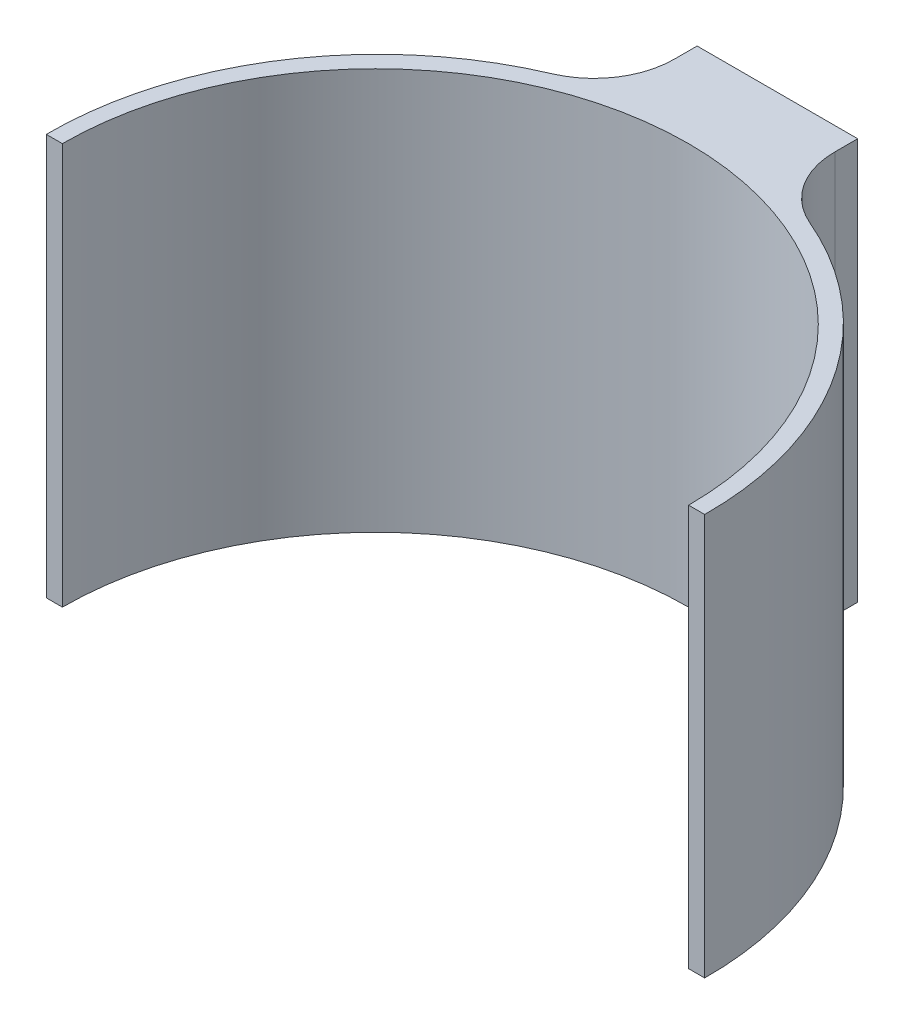
ISO-10303-21;
HEADER;
FILE_DESCRIPTION(('STEP AP214'),'2;1');
FILE_NAME('part.step','',(''),(''),'','','');
FILE_SCHEMA(('AUTOMOTIVE_DESIGN { 1 0 10303 214 1 1 1 1 }'));
ENDSEC;
DATA;
#1=APPLICATION_CONTEXT('core data for automotive mechanical design processes');
#2=APPLICATION_PROTOCOL_DEFINITION('international standard','automotive_design',2000,#1);
#3=PRODUCT_CONTEXT('',#1,'mechanical');
#4=PRODUCT('Part','Part','',(#3));
#5=PRODUCT_RELATED_PRODUCT_CATEGORY('part','',(#4));
#6=PRODUCT_DEFINITION_FORMATION('','',#4);
#7=PRODUCT_DEFINITION_CONTEXT('part definition',#1,'design');
#8=PRODUCT_DEFINITION('design','',#6,#7);
#9=PRODUCT_DEFINITION_SHAPE('','',#8);
#10=(LENGTH_UNIT() NAMED_UNIT(*) SI_UNIT(.MILLI.,.METRE.));
#11=(NAMED_UNIT(*) PLANE_ANGLE_UNIT() SI_UNIT($,.RADIAN.));
#12=(NAMED_UNIT(*) SI_UNIT($,.STERADIAN.) SOLID_ANGLE_UNIT());
#13=UNCERTAINTY_MEASURE_WITH_UNIT(LENGTH_MEASURE(1.E-05),#10,'distance_accuracy_value','');
#14=(GEOMETRIC_REPRESENTATION_CONTEXT(3) GLOBAL_UNCERTAINTY_ASSIGNED_CONTEXT((#13)) GLOBAL_UNIT_ASSIGNED_CONTEXT((#10,
#11,#12)) REPRESENTATION_CONTEXT('',''));
#15=CARTESIAN_POINT('',(0.,0.,0.));
#16=DIRECTION('',(0.,0.,1.));
#17=DIRECTION('',(1.,0.,0.));
#18=AXIS2_PLACEMENT_3D('',#15,#16,#17);
#19=CARTESIAN_POINT('',(39.,50.,0.));
#20=DIRECTION('',(0.,-1.,0.));
#21=DIRECTION('',(0.,0.,-1.));
#22=AXIS2_PLACEMENT_3D('',#19,#20,#21);
#23=CYLINDRICAL_SURFACE('',#22,39.);
#24=CARTESIAN_POINT('',(39.,0.,0.));
#25=DIRECTION('',(0.,-1.,0.));
#26=DIRECTION('',(0.,0.,-1.));
#27=AXIS2_PLACEMENT_3D('',#24,#25,#26);
#28=CIRCLE('',#27,39.);
#29=CARTESIAN_POINT('',(0.,0.,0.));
#30=VERTEX_POINT('',#29);
#31=CARTESIAN_POINT('',(78.,0.,0.));
#32=VERTEX_POINT('',#31);
#33=EDGE_CURVE('E136',#30,#32,#28,.T.);
#34=ORIENTED_EDGE('',*,*,#33,.T.);
#35=DIRECTION('',(0.,-1.,0.));
#36=VECTOR('',#35,1.);
#37=CARTESIAN_POINT('',(78.,50.,0.));
#38=LINE('',#37,#36);
#39=CARTESIAN_POINT('',(78.,50.,0.));
#40=VERTEX_POINT('',#39);
#41=EDGE_CURVE('E116',#40,#32,#38,.T.);
#42=ORIENTED_EDGE('',*,*,#41,.F.);
#43=CARTESIAN_POINT('',(39.,50.,0.));
#44=DIRECTION('',(0.,-1.,0.));
#45=DIRECTION('',(0.,0.,-1.));
#46=AXIS2_PLACEMENT_3D('',#43,#44,#45);
#47=CIRCLE('',#46,39.);
#48=CARTESIAN_POINT('',(0.,50.,0.));
#49=VERTEX_POINT('',#48);
#50=EDGE_CURVE('E124',#49,#40,#47,.T.);
#51=ORIENTED_EDGE('',*,*,#50,.F.);
#52=DIRECTION('',(0.,-1.,0.));
#53=VECTOR('',#52,1.);
#54=CARTESIAN_POINT('',(0.,50.,0.));
#55=LINE('',#54,#53);
#56=EDGE_CURVE('E190',#49,#30,#55,.T.);
#57=ORIENTED_EDGE('',*,*,#56,.T.);
#58=EDGE_LOOP('',(#34,#42,#51,#57));
#59=FACE_BOUND('',#58,.T.);
#60=ADVANCED_FACE('F35',(#59),#23,.F.);
#61=CARTESIAN_POINT('',(78.,50.,0.));
#62=DIRECTION('',(0.,0.,-1.));
#63=DIRECTION('',(-1.,0.,0.));
#64=AXIS2_PLACEMENT_3D('',#61,#62,#63);
#65=PLANE('',#64);
#66=DIRECTION('',(1.,0.,0.));
#67=VECTOR('',#66,1.);
#68=CARTESIAN_POINT('',(78.,0.,0.));
#69=LINE('',#68,#67);
#70=CARTESIAN_POINT('',(80.,0.,0.));
#71=VERTEX_POINT('',#70);
#72=EDGE_CURVE('E177',#32,#71,#69,.T.);
#73=ORIENTED_EDGE('',*,*,#72,.T.);
#74=DIRECTION('',(0.,-1.,0.));
#75=VECTOR('',#74,1.);
#76=CARTESIAN_POINT('',(80.,50.,0.));
#77=LINE('',#76,#75);
#78=CARTESIAN_POINT('',(80.,50.,0.));
#79=VERTEX_POINT('',#78);
#80=EDGE_CURVE('E119',#79,#71,#77,.T.);
#81=ORIENTED_EDGE('',*,*,#80,.F.);
#82=DIRECTION('',(1.,0.,0.));
#83=VECTOR('',#82,1.);
#84=CARTESIAN_POINT('',(78.,50.,0.));
#85=LINE('',#84,#83);
#86=EDGE_CURVE('E112',#40,#79,#85,.T.);
#87=ORIENTED_EDGE('',*,*,#86,.F.);
#88=ORIENTED_EDGE('',*,*,#41,.T.);
#89=EDGE_LOOP('',(#73,#81,#87,#88));
#90=FACE_BOUND('',#89,.T.);
#91=ADVANCED_FACE('F114',(#90),#65,.F.);
#92=CARTESIAN_POINT('',(39.,50.,-0.295189907403211));
#93=DIRECTION('',(0.,-1.,0.));
#94=DIRECTION('',(0.,0.,-1.));
#95=AXIS2_PLACEMENT_3D('',#92,#93,#94);
#96=CYLINDRICAL_SURFACE('',#95,41.0010626335639);
#97=CARTESIAN_POINT('',(39.,0.,-0.295189907403211));
#98=DIRECTION('',(0.,1.,0.));
#99=DIRECTION('',(0.,0.,-1.));
#100=AXIS2_PLACEMENT_3D('',#97,#98,#99);
#101=CIRCLE('',#100,41.0010626335639);
#102=CARTESIAN_POINT('',(55.0785130804632,0.,-38.012143047905));
#103=VERTEX_POINT('',#102);
#104=EDGE_CURVE('E172',#71,#103,#101,.T.);
#105=ORIENTED_EDGE('',*,*,#104,.T.);
#106=DIRECTION('',(0.,-1.,0.));
#107=VECTOR('',#106,1.);
#108=CARTESIAN_POINT('',(55.0785130804632,50.,-38.012143047905));
#109=LINE('',#108,#107);
#110=CARTESIAN_POINT('',(55.0785130804632,50.,-38.012143047905));
#111=VERTEX_POINT('',#110);
#112=EDGE_CURVE('E140',#103,#111,#109,.F.);
#113=ORIENTED_EDGE('',*,*,#112,.T.);
#114=CARTESIAN_POINT('',(39.,50.,-0.295189907403211));
#115=DIRECTION('',(0.,1.,0.));
#116=DIRECTION('',(0.,0.,-1.));
#117=AXIS2_PLACEMENT_3D('',#114,#115,#116);
#118=CIRCLE('',#117,41.0010626335639);
#119=EDGE_CURVE('E123',#79,#111,#118,.T.);
#120=ORIENTED_EDGE('',*,*,#119,.F.);
#121=ORIENTED_EDGE('',*,*,#80,.T.);
#122=EDGE_LOOP('',(#105,#113,#120,#121));
#123=FACE_BOUND('',#122,.T.);
#124=ADVANCED_FACE('F176',(#123),#96,.T.);
#125=CARTESIAN_POINT('',(49.,50.,-40.0580763353455));
#126=DIRECTION('',(-1.,0.,0.));
#127=DIRECTION('',(0.,0.,1.));
#128=AXIS2_PLACEMENT_3D('',#125,#126,#127);
#129=PLANE('',#128);
#130=DIRECTION('',(0.,0.,-1.));
#131=VECTOR('',#130,1.);
#132=CARTESIAN_POINT('',(49.,50.,-40.0580763353455));
#133=LINE('',#132,#131);
#134=CARTESIAN_POINT('',(49.,50.,-47.2111614922773));
#135=VERTEX_POINT('',#134);
#136=CARTESIAN_POINT('',(49.,50.,-50.0580763353454));
#137=VERTEX_POINT('',#136);
#138=EDGE_CURVE('E156',#135,#137,#133,.T.);
#139=ORIENTED_EDGE('',*,*,#138,.F.);
#140=DIRECTION('',(0.,1.,0.));
#141=VECTOR('',#140,1.);
#142=CARTESIAN_POINT('',(49.,0.,-47.2111614922773));
#143=LINE('',#142,#141);
#144=CARTESIAN_POINT('',(49.,0.,-47.2111614922773));
#145=VERTEX_POINT('',#144);
#146=EDGE_CURVE('E137',#135,#145,#143,.F.);
#147=ORIENTED_EDGE('',*,*,#146,.T.);
#148=DIRECTION('',(0.,0.,-1.));
#149=VECTOR('',#148,1.);
#150=CARTESIAN_POINT('',(49.,0.,-40.0580763353455));
#151=LINE('',#150,#149);
#152=CARTESIAN_POINT('',(49.,0.,-50.0580763353454));
#153=VERTEX_POINT('',#152);
#154=EDGE_CURVE('E174',#145,#153,#151,.T.);
#155=ORIENTED_EDGE('',*,*,#154,.T.);
#156=DIRECTION('',(0.,-1.,0.));
#157=VECTOR('',#156,1.);
#158=CARTESIAN_POINT('',(49.,50.,-50.0580763353454));
#159=LINE('',#158,#157);
#160=EDGE_CURVE('E142',#137,#153,#159,.T.);
#161=ORIENTED_EDGE('',*,*,#160,.F.);
#162=EDGE_LOOP('',(#139,#147,#155,#161));
#163=FACE_BOUND('',#162,.T.);
#164=ADVANCED_FACE('F162',(#163),#129,.F.);
#165=CARTESIAN_POINT('',(49.,50.,-50.0580763353454));
#166=DIRECTION('',(0.,0.,1.));
#167=DIRECTION('',(1.,0.,0.));
#168=AXIS2_PLACEMENT_3D('',#165,#166,#167);
#169=PLANE('',#168);
#170=DIRECTION('',(-1.,0.,0.));
#171=VECTOR('',#170,1.);
#172=CARTESIAN_POINT('',(49.,0.,-50.0580763353454));
#173=LINE('',#172,#171);
#174=CARTESIAN_POINT('',(29.,0.,-50.0580763353454));
#175=VERTEX_POINT('',#174);
#176=EDGE_CURVE('E179',#153,#175,#173,.T.);
#177=ORIENTED_EDGE('',*,*,#176,.T.);
#178=DIRECTION('',(0.,-1.,0.));
#179=VECTOR('',#178,1.);
#180=CARTESIAN_POINT('',(29.,50.,-50.0580763353454));
#181=LINE('',#180,#179);
#182=CARTESIAN_POINT('',(29.,50.,-50.0580763353454));
#183=VERTEX_POINT('',#182);
#184=EDGE_CURVE('E195',#183,#175,#181,.T.);
#185=ORIENTED_EDGE('',*,*,#184,.F.);
#186=DIRECTION('',(-1.,0.,0.));
#187=VECTOR('',#186,1.);
#188=CARTESIAN_POINT('',(49.,50.,-50.0580763353454));
#189=LINE('',#188,#187);
#190=EDGE_CURVE('E166',#137,#183,#189,.T.);
#191=ORIENTED_EDGE('',*,*,#190,.F.);
#192=ORIENTED_EDGE('',*,*,#160,.T.);
#193=EDGE_LOOP('',(#177,#185,#191,#192));
#194=FACE_BOUND('',#193,.T.);
#195=ADVANCED_FACE('F198',(#194),#169,.F.);
#196=CARTESIAN_POINT('',(29.,50.,-50.0580763353454));
#197=DIRECTION('',(1.,0.,0.));
#198=DIRECTION('',(0.,0.,-1.));
#199=AXIS2_PLACEMENT_3D('',#196,#197,#198);
#200=PLANE('',#199);
#201=DIRECTION('',(0.,0.,1.));
#202=VECTOR('',#201,1.);
#203=CARTESIAN_POINT('',(29.,0.,-50.0580763353454));
#204=LINE('',#203,#202);
#205=CARTESIAN_POINT('',(29.,0.,-47.2111614922773));
#206=VERTEX_POINT('',#205);
#207=EDGE_CURVE('E185',#175,#206,#204,.T.);
#208=ORIENTED_EDGE('',*,*,#207,.T.);
#209=DIRECTION('',(0.,1.,0.));
#210=VECTOR('',#209,1.);
#211=CARTESIAN_POINT('',(29.,50.,-47.2111614922773));
#212=LINE('',#211,#210);
#213=CARTESIAN_POINT('',(29.,50.,-47.2111614922773));
#214=VERTEX_POINT('',#213);
#215=EDGE_CURVE('E50',#206,#214,#212,.T.);
#216=ORIENTED_EDGE('',*,*,#215,.T.);
#217=DIRECTION('',(0.,0.,1.));
#218=VECTOR('',#217,1.);
#219=CARTESIAN_POINT('',(29.,50.,-50.0580763353454));
#220=LINE('',#219,#218);
#221=EDGE_CURVE('E207',#183,#214,#220,.T.);
#222=ORIENTED_EDGE('',*,*,#221,.F.);
#223=ORIENTED_EDGE('',*,*,#184,.T.);
#224=EDGE_LOOP('',(#208,#216,#222,#223));
#225=FACE_BOUND('',#224,.T.);
#226=ADVANCED_FACE('F200',(#225),#200,.F.);
#227=CARTESIAN_POINT('',(39.,50.,-0.295189907403211));
#228=DIRECTION('',(0.,-1.,0.));
#229=DIRECTION('',(0.,0.,-1.));
#230=AXIS2_PLACEMENT_3D('',#227,#228,#229);
#231=CYLINDRICAL_SURFACE('',#230,41.0010626335639);
#232=CARTESIAN_POINT('',(39.,50.,-0.295189907403211));
#233=DIRECTION('',(0.,1.,0.));
#234=DIRECTION('',(0.,0.,-1.));
#235=AXIS2_PLACEMENT_3D('',#232,#233,#234);
#236=CIRCLE('',#235,41.0010626335639);
#237=CARTESIAN_POINT('',(22.9214869195368,50.,-38.012143047905));
#238=VERTEX_POINT('',#237);
#239=CARTESIAN_POINT('',(-2.,50.,0.));
#240=VERTEX_POINT('',#239);
#241=EDGE_CURVE('E205',#238,#240,#236,.T.);
#242=ORIENTED_EDGE('',*,*,#241,.F.);
#243=DIRECTION('',(0.,-1.,0.));
#244=VECTOR('',#243,1.);
#245=CARTESIAN_POINT('',(22.9214869195368,50.,-38.012143047905));
#246=LINE('',#245,#244);
#247=CARTESIAN_POINT('',(22.9214869195368,0.,-38.012143047905));
#248=VERTEX_POINT('',#247);
#249=EDGE_CURVE('E147',#238,#248,#246,.T.);
#250=ORIENTED_EDGE('',*,*,#249,.T.);
#251=CARTESIAN_POINT('',(39.,0.,-0.295189907403211));
#252=DIRECTION('',(0.,1.,0.));
#253=DIRECTION('',(0.,0.,-1.));
#254=AXIS2_PLACEMENT_3D('',#251,#252,#253);
#255=CIRCLE('',#254,41.0010626335639);
#256=CARTESIAN_POINT('',(-2.,0.,0.));
#257=VERTEX_POINT('',#256);
#258=EDGE_CURVE('E187',#248,#257,#255,.T.);
#259=ORIENTED_EDGE('',*,*,#258,.T.);
#260=DIRECTION('',(0.,-1.,0.));
#261=VECTOR('',#260,1.);
#262=CARTESIAN_POINT('',(-2.,50.,0.));
#263=LINE('',#262,#261);
#264=EDGE_CURVE('E192',#240,#257,#263,.T.);
#265=ORIENTED_EDGE('',*,*,#264,.F.);
#266=EDGE_LOOP('',(#242,#250,#259,#265));
#267=FACE_BOUND('',#266,.T.);
#268=ADVANCED_FACE('F209',(#267),#231,.T.);
#269=CARTESIAN_POINT('',(0.,50.,0.));
#270=DIRECTION('',(0.,0.,-1.));
#271=DIRECTION('',(-1.,0.,0.));
#272=AXIS2_PLACEMENT_3D('',#269,#270,#271);
#273=PLANE('',#272);
#274=DIRECTION('',(1.,0.,0.));
#275=VECTOR('',#274,1.);
#276=CARTESIAN_POINT('',(0.,0.,0.));
#277=LINE('',#276,#275);
#278=EDGE_CURVE('E133',#257,#30,#277,.T.);
#279=ORIENTED_EDGE('',*,*,#278,.T.);
#280=ORIENTED_EDGE('',*,*,#56,.F.);
#281=DIRECTION('',(1.,0.,0.));
#282=VECTOR('',#281,1.);
#283=CARTESIAN_POINT('',(0.,50.,0.));
#284=LINE('',#283,#282);
#285=EDGE_CURVE('E129',#240,#49,#284,.T.);
#286=ORIENTED_EDGE('',*,*,#285,.F.);
#287=ORIENTED_EDGE('',*,*,#264,.T.);
#288=EDGE_LOOP('',(#279,#280,#286,#287));
#289=FACE_BOUND('',#288,.T.);
#290=ADVANCED_FACE('F217',(#289),#273,.F.);
#291=CARTESIAN_POINT('',(39.,50.,0.));
#292=DIRECTION('',(0.,-1.,0.));
#293=DIRECTION('',(0.,0.,-1.));
#294=AXIS2_PLACEMENT_3D('',#291,#292,#293);
#295=PLANE('',#294);
#296=ORIENTED_EDGE('',*,*,#50,.T.);
#297=ORIENTED_EDGE('',*,*,#86,.T.);
#298=ORIENTED_EDGE('',*,*,#119,.T.);
#299=CARTESIAN_POINT('',(59.,50.,-47.2111614922773));
#300=DIRECTION('',(0.,-1.,0.));
#301=DIRECTION('',(0.,0.,-1.));
#302=AXIS2_PLACEMENT_3D('',#299,#300,#301);
#303=CIRCLE('',#302,10.);
#304=EDGE_CURVE('E153',#111,#135,#303,.T.);
#305=ORIENTED_EDGE('',*,*,#304,.T.);
#306=ORIENTED_EDGE('',*,*,#138,.T.);
#307=ORIENTED_EDGE('',*,*,#190,.T.);
#308=ORIENTED_EDGE('',*,*,#221,.T.);
#309=CARTESIAN_POINT('',(19.,50.,-47.2111614922773));
#310=DIRECTION('',(0.,-1.,0.));
#311=DIRECTION('',(0.,0.,-1.));
#312=AXIS2_PLACEMENT_3D('',#309,#310,#311);
#313=CIRCLE('',#312,10.);
#314=EDGE_CURVE('E11',#214,#238,#313,.T.);
#315=ORIENTED_EDGE('',*,*,#314,.T.);
#316=ORIENTED_EDGE('',*,*,#241,.T.);
#317=ORIENTED_EDGE('',*,*,#285,.T.);
#318=EDGE_LOOP('',(#296,#297,#298,#305,#306,#307,#308,#315,#316,#317));
#319=FACE_BOUND('',#318,.T.);
#320=ADVANCED_FACE('F127',(#319),#295,.F.);
#321=CARTESIAN_POINT('',(39.,0.,0.));
#322=DIRECTION('',(0.,-1.,0.));
#323=DIRECTION('',(0.,0.,-1.));
#324=AXIS2_PLACEMENT_3D('',#321,#322,#323);
#325=PLANE('',#324);
#326=ORIENTED_EDGE('',*,*,#33,.F.);
#327=ORIENTED_EDGE('',*,*,#278,.F.);
#328=ORIENTED_EDGE('',*,*,#258,.F.);
#329=CARTESIAN_POINT('',(19.,0.,-47.2111614922773));
#330=DIRECTION('',(0.,-1.,0.));
#331=DIRECTION('',(0.,0.,-1.));
#332=AXIS2_PLACEMENT_3D('',#329,#330,#331);
#333=CIRCLE('',#332,10.);
#334=EDGE_CURVE('E43',#248,#206,#333,.F.);
#335=ORIENTED_EDGE('',*,*,#334,.T.);
#336=ORIENTED_EDGE('',*,*,#207,.F.);
#337=ORIENTED_EDGE('',*,*,#176,.F.);
#338=ORIENTED_EDGE('',*,*,#154,.F.);
#339=CARTESIAN_POINT('',(59.,0.,-47.2111614922773));
#340=DIRECTION('',(0.,-1.,0.));
#341=DIRECTION('',(0.,0.,-1.));
#342=AXIS2_PLACEMENT_3D('',#339,#340,#341);
#343=CIRCLE('',#342,10.);
#344=EDGE_CURVE('E151',#145,#103,#343,.F.);
#345=ORIENTED_EDGE('',*,*,#344,.T.);
#346=ORIENTED_EDGE('',*,*,#104,.F.);
#347=ORIENTED_EDGE('',*,*,#72,.F.);
#348=EDGE_LOOP('',(#326,#327,#328,#335,#336,#337,#338,#345,#346,#347));
#349=FACE_BOUND('',#348,.T.);
#350=ADVANCED_FACE('F171',(#349),#325,.T.);
#351=CARTESIAN_POINT('',(59.,50.,-47.2111614922773));
#352=DIRECTION('',(0.,-1.,0.));
#353=DIRECTION('',(0.,0.,-1.));
#354=AXIS2_PLACEMENT_3D('',#351,#352,#353);
#355=CYLINDRICAL_SURFACE('',#354,10.);
#356=ORIENTED_EDGE('',*,*,#304,.F.);
#357=ORIENTED_EDGE('',*,*,#112,.F.);
#358=ORIENTED_EDGE('',*,*,#344,.F.);
#359=ORIENTED_EDGE('',*,*,#146,.F.);
#360=EDGE_LOOP('',(#356,#357,#358,#359));
#361=FACE_BOUND('',#360,.T.);
#362=ADVANCED_FACE('F168',(#361),#355,.F.);
#363=CARTESIAN_POINT('',(19.,50.,-47.2111614922773));
#364=DIRECTION('',(0.,-1.,0.));
#365=DIRECTION('',(0.,0.,-1.));
#366=AXIS2_PLACEMENT_3D('',#363,#364,#365);
#367=CYLINDRICAL_SURFACE('',#366,10.);
#368=ORIENTED_EDGE('',*,*,#314,.F.);
#369=ORIENTED_EDGE('',*,*,#215,.F.);
#370=ORIENTED_EDGE('',*,*,#334,.F.);
#371=ORIENTED_EDGE('',*,*,#249,.F.);
#372=EDGE_LOOP('',(#368,#369,#370,#371));
#373=FACE_BOUND('',#372,.T.);
#374=ADVANCED_FACE('F37',(#373),#367,.F.);
#375=CLOSED_SHELL('',(#60,#91,#124,#164,#195,#226,#268,#290,#320,#350,#362,#374));
#376=MANIFOLD_SOLID_BREP('B2',#375);
#377=ADVANCED_BREP_SHAPE_REPRESENTATION('',(#18,#376),#14);
#378=SHAPE_DEFINITION_REPRESENTATION(#9,#377);
ENDSEC;
END-ISO-10303-21;
